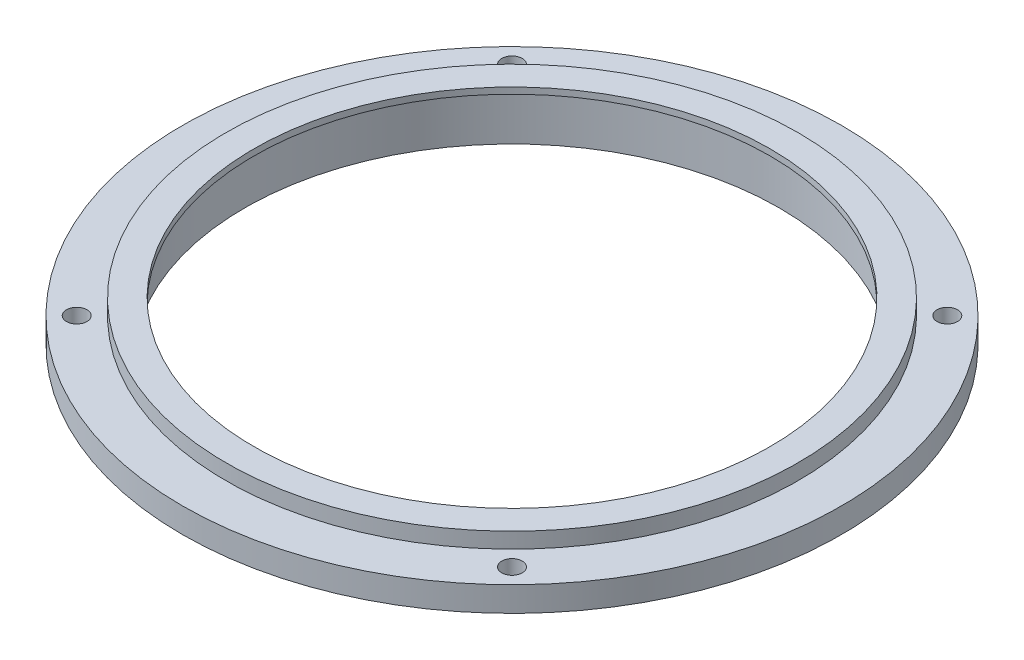
ISO-10303-21;
HEADER;
FILE_DESCRIPTION(('STEP AP214'),'2;1');
FILE_NAME('part.step','',(''),(''),'','','');
FILE_SCHEMA(('AUTOMOTIVE_DESIGN { 1 0 10303 214 1 1 1 1 }'));
ENDSEC;
DATA;
#1=APPLICATION_CONTEXT('core data for automotive mechanical design processes');
#2=APPLICATION_PROTOCOL_DEFINITION('international standard','automotive_design',2000,#1);
#3=PRODUCT_CONTEXT('',#1,'mechanical');
#4=PRODUCT('Part','Part','',(#3));
#5=PRODUCT_RELATED_PRODUCT_CATEGORY('part','',(#4));
#6=PRODUCT_DEFINITION_FORMATION('','',#4);
#7=PRODUCT_DEFINITION_CONTEXT('part definition',#1,'design');
#8=PRODUCT_DEFINITION('design','',#6,#7);
#9=PRODUCT_DEFINITION_SHAPE('','',#8);
#10=(LENGTH_UNIT() NAMED_UNIT(*) SI_UNIT(.MILLI.,.METRE.));
#11=(NAMED_UNIT(*) PLANE_ANGLE_UNIT() SI_UNIT($,.RADIAN.));
#12=(NAMED_UNIT(*) SI_UNIT($,.STERADIAN.) SOLID_ANGLE_UNIT());
#13=UNCERTAINTY_MEASURE_WITH_UNIT(LENGTH_MEASURE(1.E-05),#10,'distance_accuracy_value','');
#14=(GEOMETRIC_REPRESENTATION_CONTEXT(3) GLOBAL_UNCERTAINTY_ASSIGNED_CONTEXT((#13)) GLOBAL_UNIT_ASSIGNED_CONTEXT((#10,
#11,#12)) REPRESENTATION_CONTEXT('',''));
#15=CARTESIAN_POINT('',(0.,0.,0.));
#16=DIRECTION('',(0.,0.,1.));
#17=DIRECTION('',(1.,0.,0.));
#18=AXIS2_PLACEMENT_3D('',#15,#16,#17);
#19=CARTESIAN_POINT('',(0.,0.,0.));
#20=DIRECTION('',(0.,-1.,0.));
#21=DIRECTION('',(0.,0.,-1.));
#22=AXIS2_PLACEMENT_3D('',#19,#20,#21);
#23=CYLINDRICAL_SURFACE('',#22,41.5);
#24=CARTESIAN_POINT('',(0.,8.,0.));
#25=DIRECTION('',(0.,-1.,0.));
#26=DIRECTION('',(0.,0.,-1.));
#27=AXIS2_PLACEMENT_3D('',#24,#25,#26);
#28=CIRCLE('',#27,41.5);
#29=CARTESIAN_POINT('',(0.,8.,-41.5));
#30=VERTEX_POINT('',#29);
#31=EDGE_CURVE('E10',#30,#30,#28,.T.);
#32=ORIENTED_EDGE('',*,*,#31,.T.);
#33=EDGE_LOOP('',(#32));
#34=FACE_BOUND('',#33,.T.);
#35=CARTESIAN_POINT('',(0.,9.,0.));
#36=DIRECTION('',(0.,-1.,0.));
#37=DIRECTION('',(0.,0.,-1.));
#38=AXIS2_PLACEMENT_3D('',#35,#36,#37);
#39=CIRCLE('',#38,41.5);
#40=CARTESIAN_POINT('',(0.,9.,-41.5));
#41=VERTEX_POINT('',#40);
#42=EDGE_CURVE('E69',#41,#41,#39,.T.);
#43=ORIENTED_EDGE('',*,*,#42,.F.);
#44=EDGE_LOOP('',(#43));
#45=FACE_BOUND('',#44,.T.);
#46=ADVANCED_FACE('F34',(#34,#45),#23,.F.);
#47=CARTESIAN_POINT('',(41.5,8.,0.));
#48=DIRECTION('',(0.,-1.,0.));
#49=DIRECTION('',(0.,0.,-1.));
#50=AXIS2_PLACEMENT_3D('',#47,#48,#49);
#51=PLANE('',#50);
#52=CARTESIAN_POINT('',(0.,8.,0.));
#53=DIRECTION('',(0.,-1.,0.));
#54=DIRECTION('',(0.,0.,-1.));
#55=AXIS2_PLACEMENT_3D('',#52,#53,#54);
#56=CIRCLE('',#55,43.);
#57=CARTESIAN_POINT('',(0.,8.,-43.));
#58=VERTEX_POINT('',#57);
#59=EDGE_CURVE('E41',#58,#58,#56,.T.);
#60=ORIENTED_EDGE('',*,*,#59,.T.);
#61=EDGE_LOOP('',(#60));
#62=FACE_BOUND('',#61,.T.);
#63=ORIENTED_EDGE('',*,*,#31,.F.);
#64=EDGE_LOOP('',(#63));
#65=FACE_BOUND('',#64,.T.);
#66=ADVANCED_FACE('F107',(#62,#65),#51,.T.);
#67=CARTESIAN_POINT('',(0.,0.,0.));
#68=DIRECTION('',(0.,-1.,0.));
#69=DIRECTION('',(0.,0.,-1.));
#70=AXIS2_PLACEMENT_3D('',#67,#68,#69);
#71=CYLINDRICAL_SURFACE('',#70,43.);
#72=CARTESIAN_POINT('',(0.,0.,0.));
#73=DIRECTION('',(0.,-1.,0.));
#74=DIRECTION('',(0.,0.,-1.));
#75=AXIS2_PLACEMENT_3D('',#72,#73,#74);
#76=CIRCLE('',#75,43.);
#77=CARTESIAN_POINT('',(0.,0.,-43.));
#78=VERTEX_POINT('',#77);
#79=EDGE_CURVE('E46',#78,#78,#76,.T.);
#80=ORIENTED_EDGE('',*,*,#79,.T.);
#81=EDGE_LOOP('',(#80));
#82=FACE_BOUND('',#81,.T.);
#83=ORIENTED_EDGE('',*,*,#59,.F.);
#84=EDGE_LOOP('',(#83));
#85=FACE_BOUND('',#84,.T.);
#86=ADVANCED_FACE('F92',(#82,#85),#71,.F.);
#87=CARTESIAN_POINT('',(43.,0.,0.));
#88=DIRECTION('',(0.,-1.,0.));
#89=DIRECTION('',(0.,0.,-1.));
#90=AXIS2_PLACEMENT_3D('',#87,#88,#89);
#91=PLANE('',#90);
#92=CARTESIAN_POINT('',(0.,0.,0.));
#93=DIRECTION('',(0.,-1.,0.));
#94=DIRECTION('',(0.,0.,-1.));
#95=AXIS2_PLACEMENT_3D('',#92,#93,#94);
#96=CIRCLE('',#95,46.);
#97=CARTESIAN_POINT('',(0.,0.,-46.));
#98=VERTEX_POINT('',#97);
#99=EDGE_CURVE('E87',#98,#98,#96,.T.);
#100=ORIENTED_EDGE('',*,*,#99,.T.);
#101=EDGE_LOOP('',(#100));
#102=FACE_BOUND('',#101,.T.);
#103=ORIENTED_EDGE('',*,*,#79,.F.);
#104=EDGE_LOOP('',(#103));
#105=FACE_BOUND('',#104,.T.);
#106=ADVANCED_FACE('F95',(#102,#105),#91,.T.);
#107=CARTESIAN_POINT('',(0.,0.,0.));
#108=DIRECTION('',(0.,-1.,0.));
#109=DIRECTION('',(0.,0.,-1.));
#110=AXIS2_PLACEMENT_3D('',#107,#108,#109);
#111=CYLINDRICAL_SURFACE('',#110,46.);
#112=CARTESIAN_POINT('',(0.,2.5,0.));
#113=DIRECTION('',(0.,-1.,0.));
#114=DIRECTION('',(0.,0.,-1.));
#115=AXIS2_PLACEMENT_3D('',#112,#113,#114);
#116=CIRCLE('',#115,46.);
#117=CARTESIAN_POINT('',(0.,2.5,-46.));
#118=VERTEX_POINT('',#117);
#119=EDGE_CURVE('E84',#118,#118,#116,.T.);
#120=ORIENTED_EDGE('',*,*,#119,.T.);
#121=EDGE_LOOP('',(#120));
#122=FACE_BOUND('',#121,.T.);
#123=ORIENTED_EDGE('',*,*,#99,.F.);
#124=EDGE_LOOP('',(#123));
#125=FACE_BOUND('',#124,.T.);
#126=ADVANCED_FACE('F97',(#122,#125),#111,.T.);
#127=CARTESIAN_POINT('',(53.,2.5,0.));
#128=DIRECTION('',(0.,-1.,0.));
#129=DIRECTION('',(0.,0.,-1.));
#130=AXIS2_PLACEMENT_3D('',#127,#128,#129);
#131=PLANE('',#130);
#132=CARTESIAN_POINT('',(35.0017856687341,2.5,-35.0017856687341));
#133=DIRECTION('',(0.,-1.,0.));
#134=DIRECTION('',(0.,0.,-1.));
#135=AXIS2_PLACEMENT_3D('',#132,#133,#134);
#136=CIRCLE('',#135,1.64999999999998);
#137=CARTESIAN_POINT('',(35.0017856687341,2.5,-36.6517856687341));
#138=VERTEX_POINT('',#137);
#139=EDGE_CURVE('E175',#138,#138,#136,.T.);
#140=ORIENTED_EDGE('',*,*,#139,.F.);
#141=EDGE_LOOP('',(#140));
#142=FACE_BOUND('',#141,.T.);
#143=CARTESIAN_POINT('',(-35.0017856687341,2.5,-35.0017856687341));
#144=DIRECTION('',(0.,-1.,0.));
#145=DIRECTION('',(0.,0.,-1.));
#146=AXIS2_PLACEMENT_3D('',#143,#144,#145);
#147=CIRCLE('',#146,1.64999999999998);
#148=CARTESIAN_POINT('',(-35.0017856687341,2.5,-36.6517856687341));
#149=VERTEX_POINT('',#148);
#150=EDGE_CURVE('E63',#149,#149,#147,.T.);
#151=ORIENTED_EDGE('',*,*,#150,.F.);
#152=EDGE_LOOP('',(#151));
#153=FACE_BOUND('',#152,.T.);
#154=CARTESIAN_POINT('',(-35.0017856687341,2.5,35.0017856687341));
#155=DIRECTION('',(0.,-1.,0.));
#156=DIRECTION('',(0.,0.,-1.));
#157=AXIS2_PLACEMENT_3D('',#154,#155,#156);
#158=CIRCLE('',#157,1.64999999999999);
#159=CARTESIAN_POINT('',(-35.0017856687341,2.5,33.3517856687341));
#160=VERTEX_POINT('',#159);
#161=EDGE_CURVE('E52',#160,#160,#158,.T.);
#162=ORIENTED_EDGE('',*,*,#161,.F.);
#163=EDGE_LOOP('',(#162));
#164=FACE_BOUND('',#163,.T.);
#165=CARTESIAN_POINT('',(35.0017856687341,2.5,35.0017856687341));
#166=DIRECTION('',(0.,-1.,0.));
#167=DIRECTION('',(0.,0.,-1.));
#168=AXIS2_PLACEMENT_3D('',#165,#166,#167);
#169=CIRCLE('',#168,1.64999999999999);
#170=CARTESIAN_POINT('',(35.0017856687341,2.5,33.3517856687341));
#171=VERTEX_POINT('',#170);
#172=EDGE_CURVE('E51',#171,#171,#169,.T.);
#173=ORIENTED_EDGE('',*,*,#172,.F.);
#174=EDGE_LOOP('',(#173));
#175=FACE_BOUND('',#174,.T.);
#176=CARTESIAN_POINT('',(0.,2.5,0.));
#177=DIRECTION('',(0.,-1.,0.));
#178=DIRECTION('',(0.,0.,-1.));
#179=AXIS2_PLACEMENT_3D('',#176,#177,#178);
#180=CIRCLE('',#179,53.);
#181=CARTESIAN_POINT('',(0.,2.5,-53.));
#182=VERTEX_POINT('',#181);
#183=EDGE_CURVE('E81',#182,#182,#180,.T.);
#184=ORIENTED_EDGE('',*,*,#183,.T.);
#185=EDGE_LOOP('',(#184));
#186=FACE_BOUND('',#185,.T.);
#187=ORIENTED_EDGE('',*,*,#119,.F.);
#188=EDGE_LOOP('',(#187));
#189=FACE_BOUND('',#188,.T.);
#190=ADVANCED_FACE('F104',(#142,#153,#164,#175,#186,#189),#131,.T.);
#191=CARTESIAN_POINT('',(0.,0.,0.));
#192=DIRECTION('',(0.,-1.,0.));
#193=DIRECTION('',(0.,0.,-1.));
#194=AXIS2_PLACEMENT_3D('',#191,#192,#193);
#195=CYLINDRICAL_SURFACE('',#194,53.);
#196=CARTESIAN_POINT('',(0.,6.5,0.));
#197=DIRECTION('',(0.,-1.,0.));
#198=DIRECTION('',(0.,0.,-1.));
#199=AXIS2_PLACEMENT_3D('',#196,#197,#198);
#200=CIRCLE('',#199,53.);
#201=CARTESIAN_POINT('',(0.,6.5,-53.));
#202=VERTEX_POINT('',#201);
#203=EDGE_CURVE('E78',#202,#202,#200,.T.);
#204=ORIENTED_EDGE('',*,*,#203,.T.);
#205=EDGE_LOOP('',(#204));
#206=FACE_BOUND('',#205,.T.);
#207=ORIENTED_EDGE('',*,*,#183,.F.);
#208=EDGE_LOOP('',(#207));
#209=FACE_BOUND('',#208,.T.);
#210=ADVANCED_FACE('F133',(#206,#209),#195,.T.);
#211=CARTESIAN_POINT('',(53.,6.5,0.));
#212=DIRECTION('',(0.,1.,0.));
#213=DIRECTION('',(0.,0.,1.));
#214=AXIS2_PLACEMENT_3D('',#211,#212,#213);
#215=PLANE('',#214);
#216=CARTESIAN_POINT('',(35.0017856687341,6.5,-35.0017856687341));
#217=DIRECTION('',(0.,1.,0.));
#218=DIRECTION('',(0.,0.,1.));
#219=AXIS2_PLACEMENT_3D('',#216,#217,#218);
#220=CIRCLE('',#219,1.64999999999999);
#221=CARTESIAN_POINT('',(35.0017856687341,6.5,-33.3517856687341));
#222=VERTEX_POINT('',#221);
#223=EDGE_CURVE('E173',#222,#222,#220,.T.);
#224=ORIENTED_EDGE('',*,*,#223,.F.);
#225=EDGE_LOOP('',(#224));
#226=FACE_BOUND('',#225,.T.);
#227=CARTESIAN_POINT('',(-35.0017856687341,6.5,-35.0017856687341));
#228=DIRECTION('',(0.,1.,0.));
#229=DIRECTION('',(0.,0.,1.));
#230=AXIS2_PLACEMENT_3D('',#227,#228,#229);
#231=CIRCLE('',#230,1.64999999999999);
#232=CARTESIAN_POINT('',(-35.0017856687341,6.5,-33.3517856687341));
#233=VERTEX_POINT('',#232);
#234=EDGE_CURVE('E37',#233,#233,#231,.T.);
#235=ORIENTED_EDGE('',*,*,#234,.F.);
#236=EDGE_LOOP('',(#235));
#237=FACE_BOUND('',#236,.T.);
#238=CARTESIAN_POINT('',(-35.0017856687341,6.5,35.0017856687341));
#239=DIRECTION('',(0.,1.,0.));
#240=DIRECTION('',(0.,0.,1.));
#241=AXIS2_PLACEMENT_3D('',#238,#239,#240);
#242=CIRCLE('',#241,1.65);
#243=CARTESIAN_POINT('',(-35.0017856687341,6.5,36.6517856687341));
#244=VERTEX_POINT('',#243);
#245=EDGE_CURVE('E49',#244,#244,#242,.T.);
#246=ORIENTED_EDGE('',*,*,#245,.F.);
#247=EDGE_LOOP('',(#246));
#248=FACE_BOUND('',#247,.T.);
#249=CARTESIAN_POINT('',(35.0017856687341,6.5,35.0017856687341));
#250=DIRECTION('',(0.,1.,0.));
#251=DIRECTION('',(0.,0.,1.));
#252=AXIS2_PLACEMENT_3D('',#249,#250,#251);
#253=CIRCLE('',#252,1.65);
#254=CARTESIAN_POINT('',(35.0017856687341,6.5,36.6517856687341));
#255=VERTEX_POINT('',#254);
#256=EDGE_CURVE('E56',#255,#255,#253,.T.);
#257=ORIENTED_EDGE('',*,*,#256,.F.);
#258=EDGE_LOOP('',(#257));
#259=FACE_BOUND('',#258,.T.);
#260=CARTESIAN_POINT('',(0.,6.5,0.));
#261=DIRECTION('',(0.,-1.,0.));
#262=DIRECTION('',(0.,0.,-1.));
#263=AXIS2_PLACEMENT_3D('',#260,#261,#262);
#264=CIRCLE('',#263,46.);
#265=CARTESIAN_POINT('',(0.,6.5,-46.));
#266=VERTEX_POINT('',#265);
#267=EDGE_CURVE('E75',#266,#266,#264,.T.);
#268=ORIENTED_EDGE('',*,*,#267,.T.);
#269=EDGE_LOOP('',(#268));
#270=FACE_BOUND('',#269,.T.);
#271=ORIENTED_EDGE('',*,*,#203,.F.);
#272=EDGE_LOOP('',(#271));
#273=FACE_BOUND('',#272,.T.);
#274=ADVANCED_FACE('F127',(#226,#237,#248,#259,#270,#273),#215,.T.);
#275=CARTESIAN_POINT('',(0.,0.,0.));
#276=DIRECTION('',(0.,-1.,0.));
#277=DIRECTION('',(0.,0.,-1.));
#278=AXIS2_PLACEMENT_3D('',#275,#276,#277);
#279=CYLINDRICAL_SURFACE('',#278,46.);
#280=CARTESIAN_POINT('',(0.,9.,0.));
#281=DIRECTION('',(0.,-1.,0.));
#282=DIRECTION('',(0.,0.,-1.));
#283=AXIS2_PLACEMENT_3D('',#280,#281,#282);
#284=CIRCLE('',#283,46.);
#285=CARTESIAN_POINT('',(0.,9.,-46.));
#286=VERTEX_POINT('',#285);
#287=EDGE_CURVE('E72',#286,#286,#284,.T.);
#288=ORIENTED_EDGE('',*,*,#287,.T.);
#289=EDGE_LOOP('',(#288));
#290=FACE_BOUND('',#289,.T.);
#291=ORIENTED_EDGE('',*,*,#267,.F.);
#292=EDGE_LOOP('',(#291));
#293=FACE_BOUND('',#292,.T.);
#294=ADVANCED_FACE('F121',(#290,#293),#279,.T.);
#295=CARTESIAN_POINT('',(41.5,9.,0.));
#296=DIRECTION('',(0.,1.,0.));
#297=DIRECTION('',(0.,0.,1.));
#298=AXIS2_PLACEMENT_3D('',#295,#296,#297);
#299=PLANE('',#298);
#300=ORIENTED_EDGE('',*,*,#42,.T.);
#301=EDGE_LOOP('',(#300));
#302=FACE_BOUND('',#301,.T.);
#303=ORIENTED_EDGE('',*,*,#287,.F.);
#304=EDGE_LOOP('',(#303));
#305=FACE_BOUND('',#304,.T.);
#306=ADVANCED_FACE('F117',(#302,#305),#299,.T.);
#307=CARTESIAN_POINT('',(35.0017856687341,2.5,35.0017856687341));
#308=DIRECTION('',(0.,-1.,0.));
#309=DIRECTION('',(0.,0.,-1.));
#310=AXIS2_PLACEMENT_3D('',#307,#308,#309);
#311=CYLINDRICAL_SURFACE('',#310,1.65);
#312=ORIENTED_EDGE('',*,*,#256,.T.);
#313=EDGE_LOOP('',(#312));
#314=FACE_BOUND('',#313,.T.);
#315=ORIENTED_EDGE('',*,*,#172,.T.);
#316=EDGE_LOOP('',(#315));
#317=FACE_BOUND('',#316,.T.);
#318=ADVANCED_FACE('F120',(#314,#317),#311,.F.);
#319=CARTESIAN_POINT('',(-35.0017856687341,2.5,35.0017856687341));
#320=DIRECTION('',(0.,-1.,0.));
#321=DIRECTION('',(0.,0.,-1.));
#322=AXIS2_PLACEMENT_3D('',#319,#320,#321);
#323=CYLINDRICAL_SURFACE('',#322,1.65);
#324=ORIENTED_EDGE('',*,*,#245,.T.);
#325=EDGE_LOOP('',(#324));
#326=FACE_BOUND('',#325,.T.);
#327=ORIENTED_EDGE('',*,*,#161,.T.);
#328=EDGE_LOOP('',(#327));
#329=FACE_BOUND('',#328,.T.);
#330=ADVANCED_FACE('F157',(#326,#329),#323,.F.);
#331=CARTESIAN_POINT('',(-35.0017856687341,2.5,-35.0017856687341));
#332=DIRECTION('',(0.,-1.,0.));
#333=DIRECTION('',(0.,0.,-1.));
#334=AXIS2_PLACEMENT_3D('',#331,#332,#333);
#335=CYLINDRICAL_SURFACE('',#334,1.64999999999999);
#336=ORIENTED_EDGE('',*,*,#234,.T.);
#337=EDGE_LOOP('',(#336));
#338=FACE_BOUND('',#337,.T.);
#339=ORIENTED_EDGE('',*,*,#150,.T.);
#340=EDGE_LOOP('',(#339));
#341=FACE_BOUND('',#340,.T.);
#342=ADVANCED_FACE('F161',(#338,#341),#335,.F.);
#343=CARTESIAN_POINT('',(35.0017856687341,2.5,-35.0017856687341));
#344=DIRECTION('',(0.,-1.,0.));
#345=DIRECTION('',(0.,0.,-1.));
#346=AXIS2_PLACEMENT_3D('',#343,#344,#345);
#347=CYLINDRICAL_SURFACE('',#346,1.64999999999999);
#348=ORIENTED_EDGE('',*,*,#223,.T.);
#349=EDGE_LOOP('',(#348));
#350=FACE_BOUND('',#349,.T.);
#351=ORIENTED_EDGE('',*,*,#139,.T.);
#352=EDGE_LOOP('',(#351));
#353=FACE_BOUND('',#352,.T.);
#354=ADVANCED_FACE('F164',(#350,#353),#347,.F.);
#355=CLOSED_SHELL('',(#46,#66,#86,#106,#126,#190,#210,#274,#294,#306,#318,#330,#342,#354));
#356=MANIFOLD_SOLID_BREP('B2',#355);
#357=ADVANCED_BREP_SHAPE_REPRESENTATION('',(#18,#356),#14);
#358=SHAPE_DEFINITION_REPRESENTATION(#9,#357);
ENDSEC;
END-ISO-10303-21;
